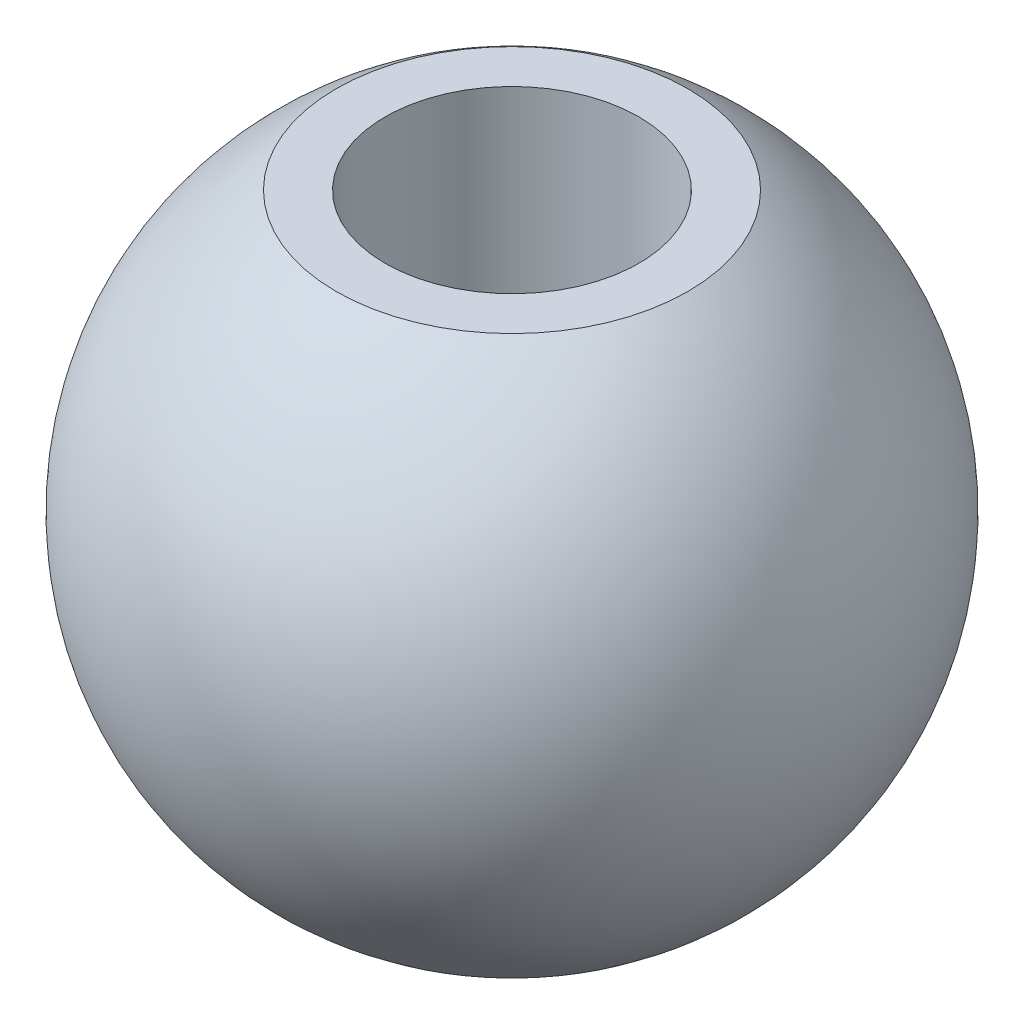
ISO-10303-21;
HEADER;
FILE_DESCRIPTION(('STEP AP214'),'2;1');
FILE_NAME('part.step','',(''),(''),'','','');
FILE_SCHEMA(('AUTOMOTIVE_DESIGN { 1 0 10303 214 1 1 1 1 }'));
ENDSEC;
DATA;
#1=APPLICATION_CONTEXT('core data for automotive mechanical design processes');
#2=APPLICATION_PROTOCOL_DEFINITION('international standard','automotive_design',2000,#1);
#3=PRODUCT_CONTEXT('',#1,'mechanical');
#4=PRODUCT('Part','Part','',(#3));
#5=PRODUCT_RELATED_PRODUCT_CATEGORY('part','',(#4));
#6=PRODUCT_DEFINITION_FORMATION('','',#4);
#7=PRODUCT_DEFINITION_CONTEXT('part definition',#1,'design');
#8=PRODUCT_DEFINITION('design','',#6,#7);
#9=PRODUCT_DEFINITION_SHAPE('','',#8);
#10=(LENGTH_UNIT() NAMED_UNIT(*) SI_UNIT(.MILLI.,.METRE.));
#11=(NAMED_UNIT(*) PLANE_ANGLE_UNIT() SI_UNIT($,.RADIAN.));
#12=(NAMED_UNIT(*) SI_UNIT($,.STERADIAN.) SOLID_ANGLE_UNIT());
#13=UNCERTAINTY_MEASURE_WITH_UNIT(LENGTH_MEASURE(1.E-05),#10,'distance_accuracy_value','');
#14=(GEOMETRIC_REPRESENTATION_CONTEXT(3) GLOBAL_UNCERTAINTY_ASSIGNED_CONTEXT((#13)) GLOBAL_UNIT_ASSIGNED_CONTEXT((#10,
#11,#12)) REPRESENTATION_CONTEXT('',''));
#15=CARTESIAN_POINT('',(0.,0.,0.));
#16=DIRECTION('',(0.,0.,1.));
#17=DIRECTION('',(1.,0.,0.));
#18=AXIS2_PLACEMENT_3D('',#15,#16,#17);
#19=CARTESIAN_POINT('',(0.,0.,0.));
#20=DIRECTION('',(0.,1.,0.));
#21=DIRECTION('',(-1.,0.,0.));
#22=AXIS2_PLACEMENT_3D('',#19,#20,#21);
#23=SPHERICAL_SURFACE('',#22,3.96);
#24=CARTESIAN_POINT('',(0.,-3.35000000000113,7.7715611723761E-13));
#25=DIRECTION('',(0.,1.,0.));
#26=DIRECTION('',(0.,0.,0.999999999999993));
#27=AXIS2_PLACEMENT_3D('',#24,#25,#26);
#28=CIRCLE('',#27,2.11165811626788);
#29=CARTESIAN_POINT('',(-2.1116581162661,-3.35000000000113,0.));
#30=VERTEX_POINT('',#29);
#31=EDGE_CURVE('E12',#30,#30,#28,.T.);
#32=CARTESIAN_POINT('',(0.,3.35000000000002,0.));
#33=DIRECTION('',(0.,1.,0.));
#34=DIRECTION('',(0.,0.,0.999999999999993));
#35=AXIS2_PLACEMENT_3D('',#32,#33,#34);
#36=CIRCLE('',#35,2.11165811626788);
#37=CARTESIAN_POINT('',(-2.11165811626788,3.35000000000002,0.));
#38=VERTEX_POINT('',#37);
#39=EDGE_CURVE('E52',#38,#38,#36,.T.);
#40=CARTESIAN_POINT('',(-2.1116581162661,-3.35000000000113,0.));
#41=CARTESIAN_POINT('',(-2.18203557359171,-3.30564228311541,0.));
#42=CARTESIAN_POINT('',(-2.2510109108053,-3.25906096425404,0.));
#43=CARTESIAN_POINT('',(-2.38589308471784,-3.16164938089484,0.));
#44=CARTESIAN_POINT('',(-2.45179992141678,-3.110819116397,0.));
#45=CARTESIAN_POINT('',(-2.58028083400942,-3.00510790007969,0.));
#46=CARTESIAN_POINT('',(-2.64285490990311,-2.95022694826022,0.));
#47=CARTESIAN_POINT('',(-2.76442253803289,-2.83663321948558,0.));
#48=CARTESIAN_POINT('',(-2.82341609026898,-2.77792044253043,0.));
#49=CARTESIAN_POINT('',(-2.93758825009317,-2.65689592882277,0.));
#50=CARTESIAN_POINT('',(-2.99276685768126,-2.59458419207028,0.));
#51=CARTESIAN_POINT('',(-3.09909008898808,-2.4666092384673,0.));
#52=CARTESIAN_POINT('',(-3.1502347127068,-2.40094602161681,0.));
#53=CARTESIAN_POINT('',(-3.24828689133563,-2.26652880773177,0.));
#54=CARTESIAN_POINT('',(-3.29519444624575,-2.19777481069723,0.));
#55=CARTESIAN_POINT('',(-3.38458624258867,-2.0574490317199,0.));
#56=CARTESIAN_POINT('',(-3.42707048402147,-1.98587724977711,0.));
#57=CARTESIAN_POINT('',(-3.5074469671658,-1.84020007813715,0.));
#58=CARTESIAN_POINT('',(-3.54533920887733,-1.76609468843998,0.));
#59=CARTESIAN_POINT('',(-3.61638124025231,-1.61564453990373,0.));
#60=CARTESIAN_POINT('',(-3.64953102991577,-1.53929978106466,0.));
#61=CARTESIAN_POINT('',(-3.71095653462972,-1.38467402390891,0.));
#62=CARTESIAN_POINT('',(-3.7392322496802,-1.30639302559223,0.));
#63=CARTESIAN_POINT('',(-3.79079733538807,-1.14820560717789,0.));
#64=CARTESIAN_POINT('',(-3.81408670604545,-1.06829918708023,0.));
#65=CARTESIAN_POINT('',(-3.85558663163315,-0.9071781965672,0.));
#66=CARTESIAN_POINT('',(-3.87379718656347,-0.825963626151823,0.));
#67=CARTESIAN_POINT('',(-3.90506717499969,-0.66254880053565,0.));
#68=CARTESIAN_POINT('',(-3.9181266085056,-0.580348545334854,0.));
#69=CARTESIAN_POINT('',(-3.93904250111687,-0.415288729376641,0.));
#70=CARTESIAN_POINT('',(-3.94689896022222,-0.332429168619224,0.));
#71=CARTESIAN_POINT('',(-3.95737770966379,-0.166379738574885,0.));
#72=CARTESIAN_POINT('',(-3.95999999999999,-0.0831898692879645,0.));
#73=CARTESIAN_POINT('',(-3.96000000000004,0.0831898692858783,0.));
#74=CARTESIAN_POINT('',(-3.95737770966388,0.1663797385728,0.));
#75=CARTESIAN_POINT('',(-3.9468989602224,0.332429168617144,0.));
#76=CARTESIAN_POINT('',(-3.93904250111709,0.415288729374566,0.));
#77=CARTESIAN_POINT('',(-3.91812660850591,0.58034854533279,0.));
#78=CARTESIAN_POINT('',(-3.90506717500004,0.662548800533593,0.));
#79=CARTESIAN_POINT('',(-3.8737971865639,0.825963626149782,0.));
#80=CARTESIAN_POINT('',(-3.85558663163363,0.907178196565169,0.));
#81=CARTESIAN_POINT('',(-3.81408670604602,1.06829918707822,0.));
#82=CARTESIAN_POINT('',(-3.79079733538868,1.14820560717589,0.));
#83=CARTESIAN_POINT('',(-3.7392322496809,1.30639302559026,0.));
#84=CARTESIAN_POINT('',(-3.71095653463045,1.38467402390696,0.));
#85=CARTESIAN_POINT('',(-3.64953102991659,1.53929978106274,0.));
#86=CARTESIAN_POINT('',(-3.61638124025317,1.61564453990183,0.));
#87=CARTESIAN_POINT('',(-3.54533920887826,1.76609468843811,0.));
#88=CARTESIAN_POINT('',(-3.50744696716678,1.8402000781353,0.));
#89=CARTESIAN_POINT('',(-3.42707048402252,1.98587724977531,0.));
#90=CARTESIAN_POINT('',(-3.38458624258976,2.05744903171812,0.));
#91=CARTESIAN_POINT('',(-3.29519444624691,2.1977748106955,0.));
#92=CARTESIAN_POINT('',(-3.24828689133684,2.26652880773006,0.));
#93=CARTESIAN_POINT('',(-3.15023471270807,2.40094602161515,0.));
#94=CARTESIAN_POINT('',(-3.09909008898939,2.46660923846567,0.));
#95=CARTESIAN_POINT('',(-2.99276685768264,2.59458419206871,0.));
#96=CARTESIAN_POINT('',(-2.93758825009458,2.65689592882123,0.));
#97=CARTESIAN_POINT('',(-2.82341609027046,2.77792044252894,0.));
#98=CARTESIAN_POINT('',(-2.7644225380344,2.83663321948413,0.));
#99=CARTESIAN_POINT('',(-2.64285490990468,2.95022694825883,0.));
#100=CARTESIAN_POINT('',(-2.58028083401101,3.00510790007834,0.));
#101=CARTESIAN_POINT('',(-2.45179992141843,3.11081911639571,0.));
#102=CARTESIAN_POINT('',(-2.38589308471951,3.16164938089358,0.));
#103=CARTESIAN_POINT('',(-2.25101091080703,3.25906096425285,0.));
#104=CARTESIAN_POINT('',(-2.18203557359346,3.30564228311426,0.));
#105=CARTESIAN_POINT('',(-2.11165811626788,3.35000000000002,0.));
#106=B_SPLINE_CURVE_WITH_KNOTS('',3,(#40,#41,#42,#43,#44,#45,#46,#47,#48,#49,#50,#51,#52,#53,
#54,#55,#56,#57,#58,#59,#60,#61,#62,#63,#64,#65,#66,#67,#68,#69,#70,#71,#72,#73,#74,#75,#76,#77,
#78,#79,#80,#81,#82,#83,#84,#85,#86,#87,#88,#89,#90,#91,#92,#93,#94,#95,#96,#97,#98,#99,#100,
#101,#102,#103,#104,#105),.UNSPECIFIED.,.F.,.F.,(4,2,2,2,2,2,2,2,2,2,2,2,2,2,2,2,2,2,2,2,2,2,2,
2,2,2,2,2,2,2,2,2,4),(0.,0.249528329555972,0.499056659111944,0.748584988667917,
0.998113318223889,1.24764164777986,1.49716997733583,1.7466983068918,1.99622663644778,
2.24575496600375,2.49528329555972,2.74481162511569,2.99433995467166,3.24386828422764,
3.49339661378361,3.74292494333958,3.99245327289555,4.24198160245152,4.49150993200749,
4.74103826156347,4.99056659111944,5.24009492067541,5.48962325023138,5.73915157978735,
5.98867990934333,6.2382082388993,6.48773656845527,6.73726489801124,6.98679322756721,
7.23632155712319,7.48584988667916,7.73537821623513,7.9849065457911),.UNSPECIFIED.);
#107=EDGE_CURVE('BSEAM38',#30,#38,#106,.T.);
#108=ORIENTED_EDGE('',*,*,#31,.T.);
#109=ORIENTED_EDGE('',*,*,#39,.F.);
#110=ORIENTED_EDGE('',*,*,#107,.T.);
#111=ORIENTED_EDGE('',*,*,#107,.F.);
#112=EDGE_LOOP('',(#108,#110,#109,#111));
#113=FACE_BOUND('',#112,.T.);
#114=ADVANCED_FACE('F38',(#113),#23,.T.);
#115=CARTESIAN_POINT('',(-1.525,-3.35000000000024,7.21644966006352E-13));
#116=DIRECTION('',(0.,-1.,0.));
#117=DIRECTION('',(0.,0.,-0.999999999999993));
#118=AXIS2_PLACEMENT_3D('',#115,#116,#117);
#119=PLANE('',#118);
#120=CARTESIAN_POINT('',(0.,-3.35000000000113,7.7715611723761E-13));
#121=DIRECTION('',(0.,1.,0.));
#122=DIRECTION('',(0.,0.,0.999999999999993));
#123=AXIS2_PLACEMENT_3D('',#120,#121,#122);
#124=CIRCLE('',#123,1.52499999999999);
#125=CARTESIAN_POINT('',(0.,-3.35000000000113,1.52500000000076));
#126=VERTEX_POINT('',#125);
#127=EDGE_CURVE('E44',#126,#126,#124,.T.);
#128=ORIENTED_EDGE('',*,*,#127,.T.);
#129=EDGE_LOOP('',(#128));
#130=FACE_BOUND('',#129,.T.);
#131=ORIENTED_EDGE('',*,*,#31,.F.);
#132=EDGE_LOOP('',(#131));
#133=FACE_BOUND('',#132,.T.);
#134=ADVANCED_FACE('F62',(#130,#133),#119,.T.);
#135=CARTESIAN_POINT('',(0.,74.9386842881686,1.27675647831893E-12));
#136=DIRECTION('',(0.,1.,0.));
#137=DIRECTION('',(0.,0.,0.999999999999993));
#138=AXIS2_PLACEMENT_3D('',#135,#136,#137);
#139=CYLINDRICAL_SURFACE('',#138,1.52499999999999);
#140=CARTESIAN_POINT('',(0.,3.35000000000002,0.));
#141=DIRECTION('',(0.,1.,0.));
#142=DIRECTION('',(0.,0.,0.999999999999993));
#143=AXIS2_PLACEMENT_3D('',#140,#141,#142);
#144=CIRCLE('',#143,1.52499999999999);
#145=CARTESIAN_POINT('',(0.,3.35000000000002,1.52499999999998));
#146=VERTEX_POINT('',#145);
#147=EDGE_CURVE('E48',#146,#146,#144,.T.);
#148=ORIENTED_EDGE('',*,*,#147,.T.);
#149=EDGE_LOOP('',(#148));
#150=FACE_BOUND('',#149,.T.);
#151=ORIENTED_EDGE('',*,*,#127,.F.);
#152=EDGE_LOOP('',(#151));
#153=FACE_BOUND('',#152,.T.);
#154=ADVANCED_FACE('F66',(#150,#153),#139,.F.);
#155=CARTESIAN_POINT('',(-2.11165811626787,3.3499999999993,3.33066907387547E-13));
#156=DIRECTION('',(0.,1.,0.));
#157=DIRECTION('',(0.,0.,0.999999999999993));
#158=AXIS2_PLACEMENT_3D('',#155,#156,#157);
#159=PLANE('',#158);
#160=ORIENTED_EDGE('',*,*,#39,.T.);
#161=EDGE_LOOP('',(#160));
#162=FACE_BOUND('',#161,.T.);
#163=ORIENTED_EDGE('',*,*,#147,.F.);
#164=EDGE_LOOP('',(#163));
#165=FACE_BOUND('',#164,.T.);
#166=ADVANCED_FACE('F58',(#162,#165),#159,.T.);
#167=CLOSED_SHELL('',(#114,#134,#154,#166));
#168=MANIFOLD_SOLID_BREP('B2',#167);
#169=ADVANCED_BREP_SHAPE_REPRESENTATION('',(#18,#168),#14);
#170=SHAPE_DEFINITION_REPRESENTATION(#9,#169);
ENDSEC;
END-ISO-10303-21;
